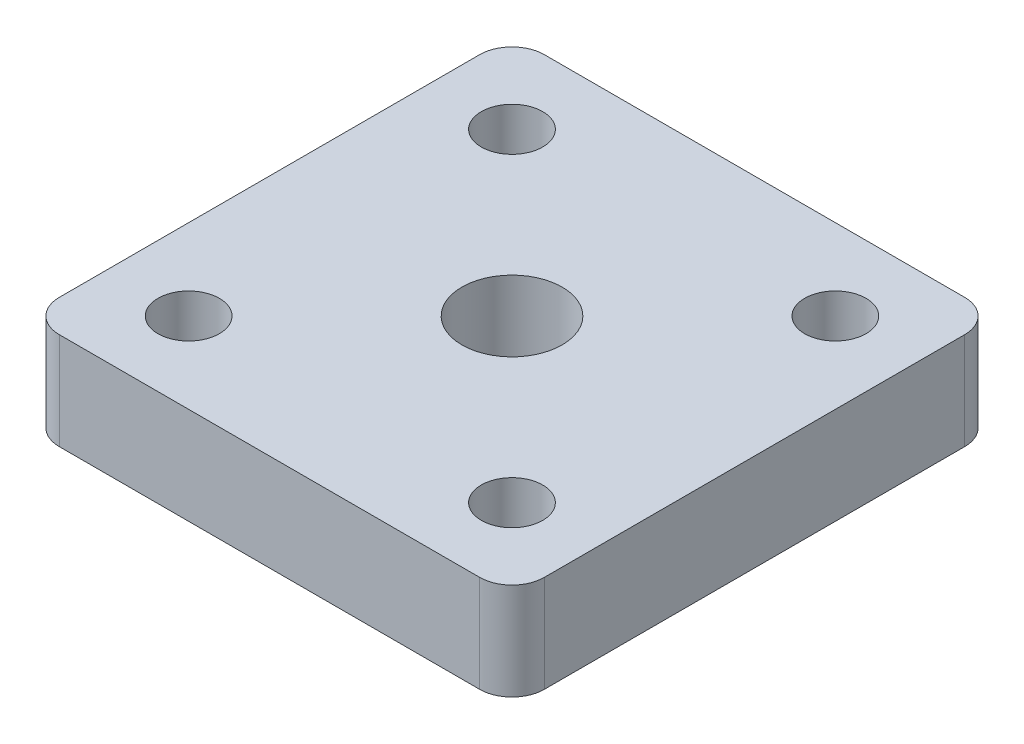
ISO-10303-21;
HEADER;
FILE_DESCRIPTION(('STEP AP214'),'2;1');
FILE_NAME('part.step','',(''),(''),'','','');
FILE_SCHEMA(('AUTOMOTIVE_DESIGN { 1 0 10303 214 1 1 1 1 }'));
ENDSEC;
DATA;
#1=APPLICATION_CONTEXT('core data for automotive mechanical design processes');
#2=APPLICATION_PROTOCOL_DEFINITION('international standard','automotive_design',2000,#1);
#3=PRODUCT_CONTEXT('',#1,'mechanical');
#4=PRODUCT('Part','Part','',(#3));
#5=PRODUCT_RELATED_PRODUCT_CATEGORY('part','',(#4));
#6=PRODUCT_DEFINITION_FORMATION('','',#4);
#7=PRODUCT_DEFINITION_CONTEXT('part definition',#1,'design');
#8=PRODUCT_DEFINITION('design','',#6,#7);
#9=PRODUCT_DEFINITION_SHAPE('','',#8);
#10=(LENGTH_UNIT() NAMED_UNIT(*) SI_UNIT(.MILLI.,.METRE.));
#11=(NAMED_UNIT(*) PLANE_ANGLE_UNIT() SI_UNIT($,.RADIAN.));
#12=(NAMED_UNIT(*) SI_UNIT($,.STERADIAN.) SOLID_ANGLE_UNIT());
#13=UNCERTAINTY_MEASURE_WITH_UNIT(LENGTH_MEASURE(1.E-05),#10,'distance_accuracy_value','');
#14=(GEOMETRIC_REPRESENTATION_CONTEXT(3) GLOBAL_UNCERTAINTY_ASSIGNED_CONTEXT((#13)) GLOBAL_UNIT_ASSIGNED_CONTEXT((#10,
#11,#12)) REPRESENTATION_CONTEXT('',''));
#15=CARTESIAN_POINT('',(0.,0.,0.));
#16=DIRECTION('',(0.,0.,1.));
#17=DIRECTION('',(1.,0.,0.));
#18=AXIS2_PLACEMENT_3D('',#15,#16,#17);
#19=CARTESIAN_POINT('',(13.,0.,-13.));
#20=DIRECTION('',(0.,-1.,0.));
#21=DIRECTION('',(0.,0.,-1.));
#22=AXIS2_PLACEMENT_3D('',#19,#20,#21);
#23=PLANE('',#22);
#24=CARTESIAN_POINT('',(-10.,0.,-10.));
#25=DIRECTION('',(0.,1.,0.));
#26=DIRECTION('',(0.,0.,1.));
#27=AXIS2_PLACEMENT_3D('',#24,#25,#26);
#28=CIRCLE('',#27,1.89865);
#29=CARTESIAN_POINT('',(-10.,0.,-8.10135));
#30=VERTEX_POINT('',#29);
#31=EDGE_CURVE('E202',#30,#30,#28,.T.);
#32=ORIENTED_EDGE('',*,*,#31,.T.);
#33=EDGE_LOOP('',(#32));
#34=FACE_BOUND('',#33,.T.);
#35=CARTESIAN_POINT('',(0.,0.,0.));
#36=DIRECTION('',(0.,1.,0.));
#37=DIRECTION('',(0.,0.,1.));
#38=AXIS2_PLACEMENT_3D('',#35,#36,#37);
#39=CIRCLE('',#38,3.1);
#40=CARTESIAN_POINT('',(0.,0.,3.1));
#41=VERTEX_POINT('',#40);
#42=EDGE_CURVE('E179',#41,#41,#39,.T.);
#43=ORIENTED_EDGE('',*,*,#42,.T.);
#44=EDGE_LOOP('',(#43));
#45=FACE_BOUND('',#44,.T.);
#46=CARTESIAN_POINT('',(13.,0.,-13.));
#47=DIRECTION('',(0.,1.,0.));
#48=DIRECTION('',(0.,0.,-1.));
#49=AXIS2_PLACEMENT_3D('',#46,#47,#48);
#50=CIRCLE('',#49,2.);
#51=CARTESIAN_POINT('',(15.,0.,-13.));
#52=VERTEX_POINT('',#51);
#53=CARTESIAN_POINT('',(13.,0.,-15.));
#54=VERTEX_POINT('',#53);
#55=EDGE_CURVE('E131',#52,#54,#50,.T.);
#56=ORIENTED_EDGE('',*,*,#55,.F.);
#57=DIRECTION('',(0.,0.,-1.));
#58=VECTOR('',#57,1.);
#59=CARTESIAN_POINT('',(15.,0.,-13.));
#60=LINE('',#59,#58);
#61=CARTESIAN_POINT('',(15.,0.,13.));
#62=VERTEX_POINT('',#61);
#63=EDGE_CURVE('E85',#62,#52,#60,.T.);
#64=ORIENTED_EDGE('',*,*,#63,.F.);
#65=CARTESIAN_POINT('',(13.,0.,13.));
#66=DIRECTION('',(0.,1.,0.));
#67=DIRECTION('',(0.,0.,1.));
#68=AXIS2_PLACEMENT_3D('',#65,#66,#67);
#69=CIRCLE('',#68,2.);
#70=CARTESIAN_POINT('',(13.,0.,15.));
#71=VERTEX_POINT('',#70);
#72=EDGE_CURVE('E79',#71,#62,#69,.T.);
#73=ORIENTED_EDGE('',*,*,#72,.F.);
#74=DIRECTION('',(1.,0.,0.));
#75=VECTOR('',#74,1.);
#76=CARTESIAN_POINT('',(-13.,0.,15.));
#77=LINE('',#76,#75);
#78=CARTESIAN_POINT('',(-13.,0.,15.));
#79=VERTEX_POINT('',#78);
#80=EDGE_CURVE('E121',#79,#71,#77,.T.);
#81=ORIENTED_EDGE('',*,*,#80,.F.);
#82=CARTESIAN_POINT('',(-13.,0.,13.));
#83=DIRECTION('',(0.,1.,0.));
#84=DIRECTION('',(0.,0.,1.));
#85=AXIS2_PLACEMENT_3D('',#82,#83,#84);
#86=CIRCLE('',#85,2.);
#87=CARTESIAN_POINT('',(-15.,0.,13.));
#88=VERTEX_POINT('',#87);
#89=EDGE_CURVE('E141',#88,#79,#86,.T.);
#90=ORIENTED_EDGE('',*,*,#89,.F.);
#91=DIRECTION('',(0.,0.,1.));
#92=VECTOR('',#91,1.);
#93=CARTESIAN_POINT('',(-15.,0.,-13.));
#94=LINE('',#93,#92);
#95=CARTESIAN_POINT('',(-15.,0.,-13.));
#96=VERTEX_POINT('',#95);
#97=EDGE_CURVE('E139',#96,#88,#94,.T.);
#98=ORIENTED_EDGE('',*,*,#97,.F.);
#99=CARTESIAN_POINT('',(-13.,0.,-13.));
#100=DIRECTION('',(0.,1.,0.));
#101=DIRECTION('',(0.,0.,1.));
#102=AXIS2_PLACEMENT_3D('',#99,#100,#101);
#103=CIRCLE('',#102,2.);
#104=CARTESIAN_POINT('',(-13.,0.,-15.));
#105=VERTEX_POINT('',#104);
#106=EDGE_CURVE('E137',#105,#96,#103,.T.);
#107=ORIENTED_EDGE('',*,*,#106,.F.);
#108=DIRECTION('',(-1.,0.,0.));
#109=VECTOR('',#108,1.);
#110=CARTESIAN_POINT('',(-13.,0.,-15.));
#111=LINE('',#110,#109);
#112=EDGE_CURVE('E134',#54,#105,#111,.T.);
#113=ORIENTED_EDGE('',*,*,#112,.F.);
#114=EDGE_LOOP('',(#56,#64,#73,#81,#90,#98,#107,#113));
#115=FACE_BOUND('',#114,.T.);
#116=CARTESIAN_POINT('',(10.,0.,10.));
#117=DIRECTION('',(0.,1.,0.));
#118=DIRECTION('',(0.,0.,1.));
#119=AXIS2_PLACEMENT_3D('',#116,#117,#118);
#120=CIRCLE('',#119,1.89865);
#121=CARTESIAN_POINT('',(10.,0.,11.89865));
#122=VERTEX_POINT('',#121);
#123=EDGE_CURVE('E182',#122,#122,#120,.T.);
#124=ORIENTED_EDGE('',*,*,#123,.T.);
#125=EDGE_LOOP('',(#124));
#126=FACE_BOUND('',#125,.T.);
#127=CARTESIAN_POINT('',(-10.,0.,10.));
#128=DIRECTION('',(0.,1.,0.));
#129=DIRECTION('',(0.,0.,1.));
#130=AXIS2_PLACEMENT_3D('',#127,#128,#129);
#131=CIRCLE('',#130,1.89865);
#132=CARTESIAN_POINT('',(-10.,0.,11.89865));
#133=VERTEX_POINT('',#132);
#134=EDGE_CURVE('E190',#133,#133,#131,.T.);
#135=ORIENTED_EDGE('',*,*,#134,.T.);
#136=EDGE_LOOP('',(#135));
#137=FACE_BOUND('',#136,.T.);
#138=CARTESIAN_POINT('',(10.,0.,-10.));
#139=DIRECTION('',(0.,1.,0.));
#140=DIRECTION('',(0.,0.,1.));
#141=AXIS2_PLACEMENT_3D('',#138,#139,#140);
#142=CIRCLE('',#141,1.89865);
#143=CARTESIAN_POINT('',(10.,0.,-8.10135));
#144=VERTEX_POINT('',#143);
#145=EDGE_CURVE('E196',#144,#144,#142,.T.);
#146=ORIENTED_EDGE('',*,*,#145,.T.);
#147=EDGE_LOOP('',(#146));
#148=FACE_BOUND('',#147,.T.);
#149=ADVANCED_FACE('F33',(#34,#45,#115,#126,#137,#148),#23,.T.);
#150=CARTESIAN_POINT('',(13.,6.,-13.));
#151=DIRECTION('',(0.,-1.,0.));
#152=DIRECTION('',(0.,0.,-1.));
#153=AXIS2_PLACEMENT_3D('',#150,#151,#152);
#154=PLANE('',#153);
#155=CARTESIAN_POINT('',(-10.,6.,-10.));
#156=DIRECTION('',(0.,1.,0.));
#157=DIRECTION('',(0.,0.,1.));
#158=AXIS2_PLACEMENT_3D('',#155,#156,#157);
#159=CIRCLE('',#158,1.89865);
#160=CARTESIAN_POINT('',(-10.,6.,-8.10135));
#161=VERTEX_POINT('',#160);
#162=EDGE_CURVE('E205',#161,#161,#159,.T.);
#163=ORIENTED_EDGE('',*,*,#162,.F.);
#164=EDGE_LOOP('',(#163));
#165=FACE_BOUND('',#164,.T.);
#166=CARTESIAN_POINT('',(-10.,6.,10.));
#167=DIRECTION('',(0.,1.,0.));
#168=DIRECTION('',(0.,0.,1.));
#169=AXIS2_PLACEMENT_3D('',#166,#167,#168);
#170=CIRCLE('',#169,1.89865);
#171=CARTESIAN_POINT('',(-10.,6.,11.89865));
#172=VERTEX_POINT('',#171);
#173=EDGE_CURVE('E193',#172,#172,#170,.T.);
#174=ORIENTED_EDGE('',*,*,#173,.F.);
#175=EDGE_LOOP('',(#174));
#176=FACE_BOUND('',#175,.T.);
#177=CARTESIAN_POINT('',(10.,6.,10.));
#178=DIRECTION('',(0.,1.,0.));
#179=DIRECTION('',(0.,0.,1.));
#180=AXIS2_PLACEMENT_3D('',#177,#178,#179);
#181=CIRCLE('',#180,1.89865);
#182=CARTESIAN_POINT('',(10.,6.,11.89865));
#183=VERTEX_POINT('',#182);
#184=EDGE_CURVE('E187',#183,#183,#181,.T.);
#185=ORIENTED_EDGE('',*,*,#184,.F.);
#186=EDGE_LOOP('',(#185));
#187=FACE_BOUND('',#186,.T.);
#188=CARTESIAN_POINT('',(13.,6.,-13.));
#189=DIRECTION('',(0.,1.,0.));
#190=DIRECTION('',(0.,0.,-1.));
#191=AXIS2_PLACEMENT_3D('',#188,#189,#190);
#192=CIRCLE('',#191,2.);
#193=CARTESIAN_POINT('',(15.,6.,-13.));
#194=VERTEX_POINT('',#193);
#195=CARTESIAN_POINT('',(13.,6.,-15.));
#196=VERTEX_POINT('',#195);
#197=EDGE_CURVE('E146',#194,#196,#192,.T.);
#198=ORIENTED_EDGE('',*,*,#197,.T.);
#199=DIRECTION('',(-1.,0.,0.));
#200=VECTOR('',#199,1.);
#201=CARTESIAN_POINT('',(-13.,6.,-15.));
#202=LINE('',#201,#200);
#203=CARTESIAN_POINT('',(-13.,6.,-15.));
#204=VERTEX_POINT('',#203);
#205=EDGE_CURVE('E93',#196,#204,#202,.T.);
#206=ORIENTED_EDGE('',*,*,#205,.T.);
#207=CARTESIAN_POINT('',(-13.,6.,-13.));
#208=DIRECTION('',(0.,1.,0.));
#209=DIRECTION('',(0.,0.,1.));
#210=AXIS2_PLACEMENT_3D('',#207,#208,#209);
#211=CIRCLE('',#210,2.);
#212=CARTESIAN_POINT('',(-15.,6.,-13.));
#213=VERTEX_POINT('',#212);
#214=EDGE_CURVE('E161',#204,#213,#211,.T.);
#215=ORIENTED_EDGE('',*,*,#214,.T.);
#216=DIRECTION('',(0.,0.,1.));
#217=VECTOR('',#216,1.);
#218=CARTESIAN_POINT('',(-15.,6.,-13.));
#219=LINE('',#218,#217);
#220=CARTESIAN_POINT('',(-15.,6.,13.));
#221=VERTEX_POINT('',#220);
#222=EDGE_CURVE('E173',#213,#221,#219,.T.);
#223=ORIENTED_EDGE('',*,*,#222,.T.);
#224=CARTESIAN_POINT('',(-13.,6.,13.));
#225=DIRECTION('',(0.,1.,0.));
#226=DIRECTION('',(0.,0.,1.));
#227=AXIS2_PLACEMENT_3D('',#224,#225,#226);
#228=CIRCLE('',#227,2.);
#229=CARTESIAN_POINT('',(-13.,6.,15.));
#230=VERTEX_POINT('',#229);
#231=EDGE_CURVE('E113',#221,#230,#228,.T.);
#232=ORIENTED_EDGE('',*,*,#231,.T.);
#233=DIRECTION('',(1.,0.,0.));
#234=VECTOR('',#233,1.);
#235=CARTESIAN_POINT('',(-13.,6.,15.));
#236=LINE('',#235,#234);
#237=CARTESIAN_POINT('',(13.,6.,15.));
#238=VERTEX_POINT('',#237);
#239=EDGE_CURVE('E106',#230,#238,#236,.T.);
#240=ORIENTED_EDGE('',*,*,#239,.T.);
#241=CARTESIAN_POINT('',(13.,6.,13.));
#242=DIRECTION('',(0.,1.,0.));
#243=DIRECTION('',(0.,0.,1.));
#244=AXIS2_PLACEMENT_3D('',#241,#242,#243);
#245=CIRCLE('',#244,2.);
#246=CARTESIAN_POINT('',(15.,6.,13.));
#247=VERTEX_POINT('',#246);
#248=EDGE_CURVE('E111',#238,#247,#245,.T.);
#249=ORIENTED_EDGE('',*,*,#248,.T.);
#250=DIRECTION('',(0.,0.,-1.));
#251=VECTOR('',#250,1.);
#252=CARTESIAN_POINT('',(15.,6.,-13.));
#253=LINE('',#252,#251);
#254=EDGE_CURVE('E50',#247,#194,#253,.T.);
#255=ORIENTED_EDGE('',*,*,#254,.T.);
#256=EDGE_LOOP('',(#198,#206,#215,#223,#232,#240,#249,#255));
#257=FACE_BOUND('',#256,.T.);
#258=CARTESIAN_POINT('',(0.,6.,0.));
#259=DIRECTION('',(0.,1.,0.));
#260=DIRECTION('',(0.,0.,1.));
#261=AXIS2_PLACEMENT_3D('',#258,#259,#260);
#262=CIRCLE('',#261,3.1);
#263=CARTESIAN_POINT('',(0.,6.,3.1));
#264=VERTEX_POINT('',#263);
#265=EDGE_CURVE('E135',#264,#264,#262,.T.);
#266=ORIENTED_EDGE('',*,*,#265,.F.);
#267=EDGE_LOOP('',(#266));
#268=FACE_BOUND('',#267,.T.);
#269=CARTESIAN_POINT('',(10.,6.,-10.));
#270=DIRECTION('',(0.,1.,0.));
#271=DIRECTION('',(0.,0.,1.));
#272=AXIS2_PLACEMENT_3D('',#269,#270,#271);
#273=CIRCLE('',#272,1.89865);
#274=CARTESIAN_POINT('',(10.,6.,-8.10135));
#275=VERTEX_POINT('',#274);
#276=EDGE_CURVE('E199',#275,#275,#273,.T.);
#277=ORIENTED_EDGE('',*,*,#276,.F.);
#278=EDGE_LOOP('',(#277));
#279=FACE_BOUND('',#278,.T.);
#280=ADVANCED_FACE('F108',(#165,#176,#187,#257,#268,#279),#154,.F.);
#281=CARTESIAN_POINT('',(13.,6.,-13.));
#282=DIRECTION('',(0.,-1.,0.));
#283=DIRECTION('',(0.,0.,-1.));
#284=AXIS2_PLACEMENT_3D('',#281,#282,#283);
#285=CYLINDRICAL_SURFACE('',#284,2.);
#286=ORIENTED_EDGE('',*,*,#55,.T.);
#287=DIRECTION('',(0.,-1.,0.));
#288=VECTOR('',#287,1.);
#289=CARTESIAN_POINT('',(13.,6.,-15.));
#290=LINE('',#289,#288);
#291=EDGE_CURVE('E11',#196,#54,#290,.T.);
#292=ORIENTED_EDGE('',*,*,#291,.F.);
#293=ORIENTED_EDGE('',*,*,#197,.F.);
#294=DIRECTION('',(0.,-1.,0.));
#295=VECTOR('',#294,1.);
#296=CARTESIAN_POINT('',(15.,6.,-13.));
#297=LINE('',#296,#295);
#298=EDGE_CURVE('E127',#194,#52,#297,.T.);
#299=ORIENTED_EDGE('',*,*,#298,.T.);
#300=EDGE_LOOP('',(#286,#292,#293,#299));
#301=FACE_BOUND('',#300,.T.);
#302=ADVANCED_FACE('F35',(#301),#285,.T.);
#303=CARTESIAN_POINT('',(-13.,6.,-15.));
#304=DIRECTION('',(0.,0.,1.));
#305=DIRECTION('',(1.,0.,0.));
#306=AXIS2_PLACEMENT_3D('',#303,#304,#305);
#307=PLANE('',#306);
#308=ORIENTED_EDGE('',*,*,#112,.T.);
#309=DIRECTION('',(0.,-1.,0.));
#310=VECTOR('',#309,1.);
#311=CARTESIAN_POINT('',(-13.,6.,-15.));
#312=LINE('',#311,#310);
#313=EDGE_CURVE('E42',#204,#105,#312,.T.);
#314=ORIENTED_EDGE('',*,*,#313,.F.);
#315=ORIENTED_EDGE('',*,*,#205,.F.);
#316=ORIENTED_EDGE('',*,*,#291,.T.);
#317=EDGE_LOOP('',(#308,#314,#315,#316));
#318=FACE_BOUND('',#317,.T.);
#319=ADVANCED_FACE('F253',(#318),#307,.F.);
#320=CARTESIAN_POINT('',(-13.,6.,-13.));
#321=DIRECTION('',(0.,-1.,0.));
#322=DIRECTION('',(0.,0.,-1.));
#323=AXIS2_PLACEMENT_3D('',#320,#321,#322);
#324=CYLINDRICAL_SURFACE('',#323,2.);
#325=ORIENTED_EDGE('',*,*,#106,.T.);
#326=DIRECTION('',(0.,-1.,0.));
#327=VECTOR('',#326,1.);
#328=CARTESIAN_POINT('',(-15.,6.,-13.));
#329=LINE('',#328,#327);
#330=EDGE_CURVE('E153',#213,#96,#329,.T.);
#331=ORIENTED_EDGE('',*,*,#330,.F.);
#332=ORIENTED_EDGE('',*,*,#214,.F.);
#333=ORIENTED_EDGE('',*,*,#313,.T.);
#334=EDGE_LOOP('',(#325,#331,#332,#333));
#335=FACE_BOUND('',#334,.T.);
#336=ADVANCED_FACE('F159',(#335),#324,.T.);
#337=CARTESIAN_POINT('',(-15.,6.,-13.));
#338=DIRECTION('',(1.,0.,0.));
#339=DIRECTION('',(0.,0.,-1.));
#340=AXIS2_PLACEMENT_3D('',#337,#338,#339);
#341=PLANE('',#340);
#342=ORIENTED_EDGE('',*,*,#97,.T.);
#343=DIRECTION('',(0.,-1.,0.));
#344=VECTOR('',#343,1.);
#345=CARTESIAN_POINT('',(-15.,6.,13.));
#346=LINE('',#345,#344);
#347=EDGE_CURVE('E150',#221,#88,#346,.T.);
#348=ORIENTED_EDGE('',*,*,#347,.F.);
#349=ORIENTED_EDGE('',*,*,#222,.F.);
#350=ORIENTED_EDGE('',*,*,#330,.T.);
#351=EDGE_LOOP('',(#342,#348,#349,#350));
#352=FACE_BOUND('',#351,.T.);
#353=ADVANCED_FACE('F169',(#352),#341,.F.);
#354=CARTESIAN_POINT('',(-13.,6.,13.));
#355=DIRECTION('',(0.,-1.,0.));
#356=DIRECTION('',(0.,0.,-1.));
#357=AXIS2_PLACEMENT_3D('',#354,#355,#356);
#358=CYLINDRICAL_SURFACE('',#357,2.);
#359=ORIENTED_EDGE('',*,*,#89,.T.);
#360=DIRECTION('',(0.,-1.,0.));
#361=VECTOR('',#360,1.);
#362=CARTESIAN_POINT('',(-13.,6.,15.));
#363=LINE('',#362,#361);
#364=EDGE_CURVE('E122',#230,#79,#363,.T.);
#365=ORIENTED_EDGE('',*,*,#364,.F.);
#366=ORIENTED_EDGE('',*,*,#231,.F.);
#367=ORIENTED_EDGE('',*,*,#347,.T.);
#368=EDGE_LOOP('',(#359,#365,#366,#367));
#369=FACE_BOUND('',#368,.T.);
#370=ADVANCED_FACE('F172',(#369),#358,.T.);
#371=CARTESIAN_POINT('',(-13.,6.,15.));
#372=DIRECTION('',(0.,0.,-1.));
#373=DIRECTION('',(-1.,0.,0.));
#374=AXIS2_PLACEMENT_3D('',#371,#372,#373);
#375=PLANE('',#374);
#376=ORIENTED_EDGE('',*,*,#80,.T.);
#377=DIRECTION('',(0.,-1.,0.));
#378=VECTOR('',#377,1.);
#379=CARTESIAN_POINT('',(13.,6.,15.));
#380=LINE('',#379,#378);
#381=EDGE_CURVE('E118',#238,#71,#380,.T.);
#382=ORIENTED_EDGE('',*,*,#381,.F.);
#383=ORIENTED_EDGE('',*,*,#239,.F.);
#384=ORIENTED_EDGE('',*,*,#364,.T.);
#385=EDGE_LOOP('',(#376,#382,#383,#384));
#386=FACE_BOUND('',#385,.T.);
#387=ADVANCED_FACE('F119',(#386),#375,.F.);
#388=CARTESIAN_POINT('',(13.,6.,13.));
#389=DIRECTION('',(0.,-1.,0.));
#390=DIRECTION('',(0.,0.,-1.));
#391=AXIS2_PLACEMENT_3D('',#388,#389,#390);
#392=CYLINDRICAL_SURFACE('',#391,2.);
#393=ORIENTED_EDGE('',*,*,#72,.T.);
#394=DIRECTION('',(0.,-1.,0.));
#395=VECTOR('',#394,1.);
#396=CARTESIAN_POINT('',(15.,6.,13.));
#397=LINE('',#396,#395);
#398=EDGE_CURVE('E123',#247,#62,#397,.T.);
#399=ORIENTED_EDGE('',*,*,#398,.F.);
#400=ORIENTED_EDGE('',*,*,#248,.F.);
#401=ORIENTED_EDGE('',*,*,#381,.T.);
#402=EDGE_LOOP('',(#393,#399,#400,#401));
#403=FACE_BOUND('',#402,.T.);
#404=ADVANCED_FACE('F125',(#403),#392,.T.);
#405=CARTESIAN_POINT('',(15.,6.,-13.));
#406=DIRECTION('',(-1.,0.,0.));
#407=DIRECTION('',(0.,0.,1.));
#408=AXIS2_PLACEMENT_3D('',#405,#406,#407);
#409=PLANE('',#408);
#410=ORIENTED_EDGE('',*,*,#63,.T.);
#411=ORIENTED_EDGE('',*,*,#298,.F.);
#412=ORIENTED_EDGE('',*,*,#254,.F.);
#413=ORIENTED_EDGE('',*,*,#398,.T.);
#414=EDGE_LOOP('',(#410,#411,#412,#413));
#415=FACE_BOUND('',#414,.T.);
#416=ADVANCED_FACE('F231',(#415),#409,.F.);
#417=CARTESIAN_POINT('',(0.,6.,0.));
#418=DIRECTION('',(0.,-1.,0.));
#419=DIRECTION('',(0.,0.,-1.));
#420=AXIS2_PLACEMENT_3D('',#417,#418,#419);
#421=CYLINDRICAL_SURFACE('',#420,3.1);
#422=ORIENTED_EDGE('',*,*,#265,.T.);
#423=EDGE_LOOP('',(#422));
#424=FACE_BOUND('',#423,.T.);
#425=ORIENTED_EDGE('',*,*,#42,.F.);
#426=EDGE_LOOP('',(#425));
#427=FACE_BOUND('',#426,.T.);
#428=ADVANCED_FACE('F221',(#424,#427),#421,.F.);
#429=CARTESIAN_POINT('',(10.,6.,10.));
#430=DIRECTION('',(0.,1.,0.));
#431=DIRECTION('',(0.,0.,1.));
#432=AXIS2_PLACEMENT_3D('',#429,#430,#431);
#433=CYLINDRICAL_SURFACE('',#432,1.89865);
#434=ORIENTED_EDGE('',*,*,#123,.F.);
#435=EDGE_LOOP('',(#434));
#436=FACE_BOUND('',#435,.T.);
#437=ORIENTED_EDGE('',*,*,#184,.T.);
#438=EDGE_LOOP('',(#437));
#439=FACE_BOUND('',#438,.T.);
#440=ADVANCED_FACE('F218',(#436,#439),#433,.F.);
#441=CARTESIAN_POINT('',(-10.,6.,10.));
#442=DIRECTION('',(0.,1.,0.));
#443=DIRECTION('',(0.,0.,1.));
#444=AXIS2_PLACEMENT_3D('',#441,#442,#443);
#445=CYLINDRICAL_SURFACE('',#444,1.89865);
#446=ORIENTED_EDGE('',*,*,#134,.F.);
#447=EDGE_LOOP('',(#446));
#448=FACE_BOUND('',#447,.T.);
#449=ORIENTED_EDGE('',*,*,#173,.T.);
#450=EDGE_LOOP('',(#449));
#451=FACE_BOUND('',#450,.T.);
#452=ADVANCED_FACE('F220',(#448,#451),#445,.F.);
#453=CARTESIAN_POINT('',(10.,6.,-10.));
#454=DIRECTION('',(0.,1.,0.));
#455=DIRECTION('',(0.,0.,1.));
#456=AXIS2_PLACEMENT_3D('',#453,#454,#455);
#457=CYLINDRICAL_SURFACE('',#456,1.89865);
#458=ORIENTED_EDGE('',*,*,#145,.F.);
#459=EDGE_LOOP('',(#458));
#460=FACE_BOUND('',#459,.T.);
#461=ORIENTED_EDGE('',*,*,#276,.T.);
#462=EDGE_LOOP('',(#461));
#463=FACE_BOUND('',#462,.T.);
#464=ADVANCED_FACE('F228',(#460,#463),#457,.F.);
#465=CARTESIAN_POINT('',(-10.,6.,-10.));
#466=DIRECTION('',(0.,1.,0.));
#467=DIRECTION('',(0.,0.,1.));
#468=AXIS2_PLACEMENT_3D('',#465,#466,#467);
#469=CYLINDRICAL_SURFACE('',#468,1.89865);
#470=ORIENTED_EDGE('',*,*,#31,.F.);
#471=EDGE_LOOP('',(#470));
#472=FACE_BOUND('',#471,.T.);
#473=ORIENTED_EDGE('',*,*,#162,.T.);
#474=EDGE_LOOP('',(#473));
#475=FACE_BOUND('',#474,.T.);
#476=ADVANCED_FACE('F209',(#472,#475),#469,.F.);
#477=CLOSED_SHELL('',(#149,#280,#302,#319,#336,#353,#370,#387,#404,#416,#428,#440,#452,#464,#476));
#478=MANIFOLD_SOLID_BREP('B2',#477);
#479=ADVANCED_BREP_SHAPE_REPRESENTATION('',(#18,#478),#14);
#480=SHAPE_DEFINITION_REPRESENTATION(#9,#479);
ENDSEC;
END-ISO-10303-21;
